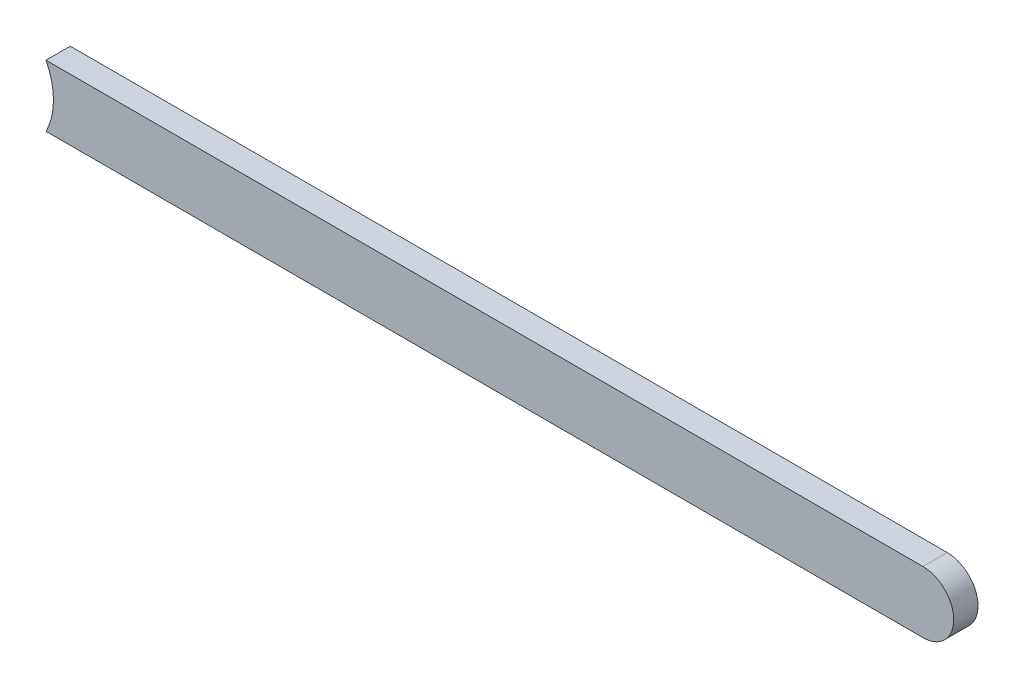
ISO-10303-21;
HEADER;
FILE_DESCRIPTION(('STEP AP214'),'2;1');
FILE_NAME('part.step','',(''),(''),'','','');
FILE_SCHEMA(('AUTOMOTIVE_DESIGN { 1 0 10303 214 1 1 1 1 }'));
ENDSEC;
DATA;
#1=APPLICATION_CONTEXT('core data for automotive mechanical design processes');
#2=APPLICATION_PROTOCOL_DEFINITION('international standard','automotive_design',2000,#1);
#3=PRODUCT_CONTEXT('',#1,'mechanical');
#4=PRODUCT('Part','Part','',(#3));
#5=PRODUCT_RELATED_PRODUCT_CATEGORY('part','',(#4));
#6=PRODUCT_DEFINITION_FORMATION('','',#4);
#7=PRODUCT_DEFINITION_CONTEXT('part definition',#1,'design');
#8=PRODUCT_DEFINITION('design','',#6,#7);
#9=PRODUCT_DEFINITION_SHAPE('','',#8);
#10=(LENGTH_UNIT() NAMED_UNIT(*) SI_UNIT(.MILLI.,.METRE.));
#11=(NAMED_UNIT(*) PLANE_ANGLE_UNIT() SI_UNIT($,.RADIAN.));
#12=(NAMED_UNIT(*) SI_UNIT($,.STERADIAN.) SOLID_ANGLE_UNIT());
#13=UNCERTAINTY_MEASURE_WITH_UNIT(LENGTH_MEASURE(1.E-05),#10,'distance_accuracy_value','');
#14=(GEOMETRIC_REPRESENTATION_CONTEXT(3) GLOBAL_UNCERTAINTY_ASSIGNED_CONTEXT((#13)) GLOBAL_UNIT_ASSIGNED_CONTEXT((#10,
#11,#12)) REPRESENTATION_CONTEXT('',''));
#15=CARTESIAN_POINT('',(0.,0.,0.));
#16=DIRECTION('',(0.,0.,1.));
#17=DIRECTION('',(1.,0.,0.));
#18=AXIS2_PLACEMENT_3D('',#15,#16,#17);
#19=CARTESIAN_POINT('',(129.518202090858,103.505,0.));
#20=DIRECTION('',(0.,1.,0.));
#21=DIRECTION('',(1.,0.,0.));
#22=AXIS2_PLACEMENT_3D('',#19,#20,#21);
#23=PLANE('',#22);
#24=DIRECTION('',(1.,0.,0.));
#25=VECTOR('',#24,1.);
#26=CARTESIAN_POINT('',(129.0247356,103.505,0.1999996));
#27=LINE('',#26,#25);
#28=CARTESIAN_POINT('',(129.518202090858,103.505,0.1999996));
#29=VERTEX_POINT('',#28);
#30=CARTESIAN_POINT('',(136.7489264,103.505,0.1999996));
#31=VERTEX_POINT('',#30);
#32=EDGE_CURVE('E11',#29,#31,#27,.T.);
#33=ORIENTED_EDGE('',*,*,#32,.F.);
#34=DIRECTION('',(0.,0.,1.));
#35=VECTOR('',#34,1.);
#36=CARTESIAN_POINT('',(129.518202090858,103.505,0.));
#37=LINE('',#36,#35);
#38=CARTESIAN_POINT('',(129.518202090858,103.505,0.));
#39=VERTEX_POINT('',#38);
#40=EDGE_CURVE('E24',#39,#29,#37,.T.);
#41=ORIENTED_EDGE('',*,*,#40,.F.);
#42=DIRECTION('',(1.,0.,0.));
#43=VECTOR('',#42,1.);
#44=CARTESIAN_POINT('',(129.0247356,103.505,0.));
#45=LINE('',#44,#43);
#46=CARTESIAN_POINT('',(136.7489264,103.505,0.));
#47=VERTEX_POINT('',#46);
#48=EDGE_CURVE('E82',#39,#47,#45,.T.);
#49=ORIENTED_EDGE('',*,*,#48,.T.);
#50=DIRECTION('',(0.,0.,1.));
#51=VECTOR('',#50,1.);
#52=CARTESIAN_POINT('',(136.7489264,103.505,0.));
#53=LINE('',#52,#51);
#54=EDGE_CURVE('E37',#47,#31,#53,.T.);
#55=ORIENTED_EDGE('',*,*,#54,.T.);
#56=EDGE_LOOP('',(#33,#41,#49,#55));
#57=FACE_BOUND('',#56,.T.);
#58=ADVANCED_FACE('F17',(#57),#23,.F.);
#59=CARTESIAN_POINT('',(136.7489264,103.759,0.));
#60=DIRECTION('',(0.,0.,-1.));
#61=DIRECTION('',(-1.11896493820486E-13,-1.,0.));
#62=AXIS2_PLACEMENT_3D('',#59,#60,#61);
#63=CYLINDRICAL_SURFACE('',#62,0.254);
#64=CARTESIAN_POINT('',(136.7489264,103.759,0.1999996));
#65=DIRECTION('',(0.,0.,1.));
#66=DIRECTION('',(-1.11896493820486E-13,-1.,0.));
#67=AXIS2_PLACEMENT_3D('',#64,#65,#66);
#68=CIRCLE('',#67,0.254);
#69=CARTESIAN_POINT('',(136.7489264,104.013,0.1999996));
#70=VERTEX_POINT('',#69);
#71=EDGE_CURVE('E97',#31,#70,#68,.T.);
#72=ORIENTED_EDGE('',*,*,#71,.F.);
#73=ORIENTED_EDGE('',*,*,#54,.F.);
#74=CARTESIAN_POINT('',(136.7489264,103.759,0.));
#75=DIRECTION('',(0.,0.,1.));
#76=DIRECTION('',(-1.11896493820486E-13,-1.,0.));
#77=AXIS2_PLACEMENT_3D('',#74,#75,#76);
#78=CIRCLE('',#77,0.254);
#79=CARTESIAN_POINT('',(136.7489264,104.013,0.));
#80=VERTEX_POINT('',#79);
#81=EDGE_CURVE('E94',#47,#80,#78,.T.);
#82=ORIENTED_EDGE('',*,*,#81,.T.);
#83=DIRECTION('',(0.,0.,1.));
#84=VECTOR('',#83,1.);
#85=CARTESIAN_POINT('',(136.7489264,104.013,0.));
#86=LINE('',#85,#84);
#87=EDGE_CURVE('E92',#80,#70,#86,.T.);
#88=ORIENTED_EDGE('',*,*,#87,.T.);
#89=EDGE_LOOP('',(#72,#73,#82,#88));
#90=FACE_BOUND('',#89,.T.);
#91=ADVANCED_FACE('F103',(#90),#63,.T.);
#92=CARTESIAN_POINT('',(136.7489264,104.013,0.));
#93=DIRECTION('',(0.,-1.,0.));
#94=DIRECTION('',(-1.,0.,0.));
#95=AXIS2_PLACEMENT_3D('',#92,#93,#94);
#96=PLANE('',#95);
#97=DIRECTION('',(-1.,0.,0.));
#98=VECTOR('',#97,1.);
#99=CARTESIAN_POINT('',(136.7489264,104.013,0.1999996));
#100=LINE('',#99,#98);
#101=CARTESIAN_POINT('',(129.518202090858,104.013,0.1999996));
#102=VERTEX_POINT('',#101);
#103=EDGE_CURVE('E89',#70,#102,#100,.T.);
#104=ORIENTED_EDGE('',*,*,#103,.F.);
#105=ORIENTED_EDGE('',*,*,#87,.F.);
#106=DIRECTION('',(-1.,0.,0.));
#107=VECTOR('',#106,1.);
#108=CARTESIAN_POINT('',(136.7489264,104.013,0.));
#109=LINE('',#108,#107);
#110=CARTESIAN_POINT('',(129.518202090858,104.013,0.));
#111=VERTEX_POINT('',#110);
#112=EDGE_CURVE('E87',#80,#111,#109,.T.);
#113=ORIENTED_EDGE('',*,*,#112,.T.);
#114=DIRECTION('',(0.,0.,1.));
#115=VECTOR('',#114,1.);
#116=CARTESIAN_POINT('',(129.518202090858,104.013,0.));
#117=LINE('',#116,#115);
#118=EDGE_CURVE('E69',#111,#102,#117,.T.);
#119=ORIENTED_EDGE('',*,*,#118,.T.);
#120=EDGE_LOOP('',(#104,#105,#113,#119));
#121=FACE_BOUND('',#120,.T.);
#122=ADVANCED_FACE('F108',(#121),#96,.F.);
#123=CARTESIAN_POINT('',(129.0247356,103.759,0.));
#124=DIRECTION('',(0.,0.,-1.));
#125=DIRECTION('',(1.,0.,0.));
#126=AXIS2_PLACEMENT_3D('',#123,#124,#125);
#127=CYLINDRICAL_SURFACE('',#126,0.55500016);
#128=DIRECTION('',(0.,0.,1.));
#129=VECTOR('',#128,1.);
#130=CARTESIAN_POINT('',(129.57973576,103.759,0.));
#131=LINE('',#130,#129);
#132=CARTESIAN_POINT('',(129.57973576,103.759,0.));
#133=VERTEX_POINT('',#132);
#134=CARTESIAN_POINT('',(129.57973576,103.759,0.1999996));
#135=VERTEX_POINT('',#134);
#136=EDGE_CURVE('E59',#133,#135,#131,.T.);
#137=ORIENTED_EDGE('',*,*,#136,.T.);
#138=CARTESIAN_POINT('',(129.0247356,103.759,0.1999996));
#139=DIRECTION('',(0.,0.,1.));
#140=DIRECTION('',(1.,0.,0.));
#141=AXIS2_PLACEMENT_3D('',#138,#139,#140);
#142=CIRCLE('',#141,0.55500016);
#143=EDGE_CURVE('E70',#135,#102,#142,.T.);
#144=ORIENTED_EDGE('',*,*,#143,.T.);
#145=ORIENTED_EDGE('',*,*,#118,.F.);
#146=CARTESIAN_POINT('',(129.0247356,103.759,0.));
#147=DIRECTION('',(0.,0.,1.));
#148=DIRECTION('',(1.,0.,0.));
#149=AXIS2_PLACEMENT_3D('',#146,#147,#148);
#150=CIRCLE('',#149,0.55500016);
#151=EDGE_CURVE('E73',#133,#111,#150,.T.);
#152=ORIENTED_EDGE('',*,*,#151,.F.);
#153=EDGE_LOOP('',(#137,#144,#145,#152));
#154=FACE_BOUND('',#153,.T.);
#155=ADVANCED_FACE('F74',(#154),#127,.F.);
#156=CARTESIAN_POINT('',(129.0247356,103.759,0.));
#157=DIRECTION('',(0.,0.,-1.));
#158=DIRECTION('',(1.,0.,0.));
#159=AXIS2_PLACEMENT_3D('',#156,#157,#158);
#160=CYLINDRICAL_SURFACE('',#159,0.55500016);
#161=ORIENTED_EDGE('',*,*,#40,.T.);
#162=CARTESIAN_POINT('',(129.0247356,103.759,0.1999996));
#163=DIRECTION('',(0.,0.,1.));
#164=DIRECTION('',(1.,0.,0.));
#165=AXIS2_PLACEMENT_3D('',#162,#163,#164);
#166=CIRCLE('',#165,0.55500016);
#167=EDGE_CURVE('E65',#29,#135,#166,.T.);
#168=ORIENTED_EDGE('',*,*,#167,.T.);
#169=ORIENTED_EDGE('',*,*,#136,.F.);
#170=EDGE_CURVE('E63',#39,#133,#150,.T.);
#171=ORIENTED_EDGE('',*,*,#170,.F.);
#172=EDGE_LOOP('',(#161,#168,#169,#171));
#173=FACE_BOUND('',#172,.T.);
#174=ADVANCED_FACE('F61',(#173),#160,.F.);
#175=CARTESIAN_POINT('',(129.0247356,103.505,0.));
#176=DIRECTION('',(0.,0.,-1.));
#177=DIRECTION('',(-1.,0.,0.));
#178=AXIS2_PLACEMENT_3D('',#175,#176,#177);
#179=PLANE('',#178);
#180=ORIENTED_EDGE('',*,*,#48,.F.);
#181=ORIENTED_EDGE('',*,*,#170,.T.);
#182=ORIENTED_EDGE('',*,*,#151,.T.);
#183=ORIENTED_EDGE('',*,*,#112,.F.);
#184=ORIENTED_EDGE('',*,*,#81,.F.);
#185=EDGE_LOOP('',(#180,#181,#182,#183,#184));
#186=FACE_BOUND('',#185,.T.);
#187=ADVANCED_FACE('F80',(#186),#179,.T.);
#188=CARTESIAN_POINT('',(129.0247356,103.505,0.1999996));
#189=DIRECTION('',(0.,0.,-1.));
#190=DIRECTION('',(-1.,0.,0.));
#191=AXIS2_PLACEMENT_3D('',#188,#189,#190);
#192=PLANE('',#191);
#193=ORIENTED_EDGE('',*,*,#167,.F.);
#194=ORIENTED_EDGE('',*,*,#32,.T.);
#195=ORIENTED_EDGE('',*,*,#71,.T.);
#196=ORIENTED_EDGE('',*,*,#103,.T.);
#197=ORIENTED_EDGE('',*,*,#143,.F.);
#198=EDGE_LOOP('',(#193,#194,#195,#196,#197));
#199=FACE_BOUND('',#198,.T.);
#200=ADVANCED_FACE('F106',(#199),#192,.F.);
#201=CLOSED_SHELL('',(#58,#91,#122,#155,#174,#187,#200));
#202=MANIFOLD_SOLID_BREP('B1',#201);
#203=ADVANCED_BREP_SHAPE_REPRESENTATION('',(#18,#202),#14);
#204=SHAPE_DEFINITION_REPRESENTATION(#9,#203);
ENDSEC;
END-ISO-10303-21;
